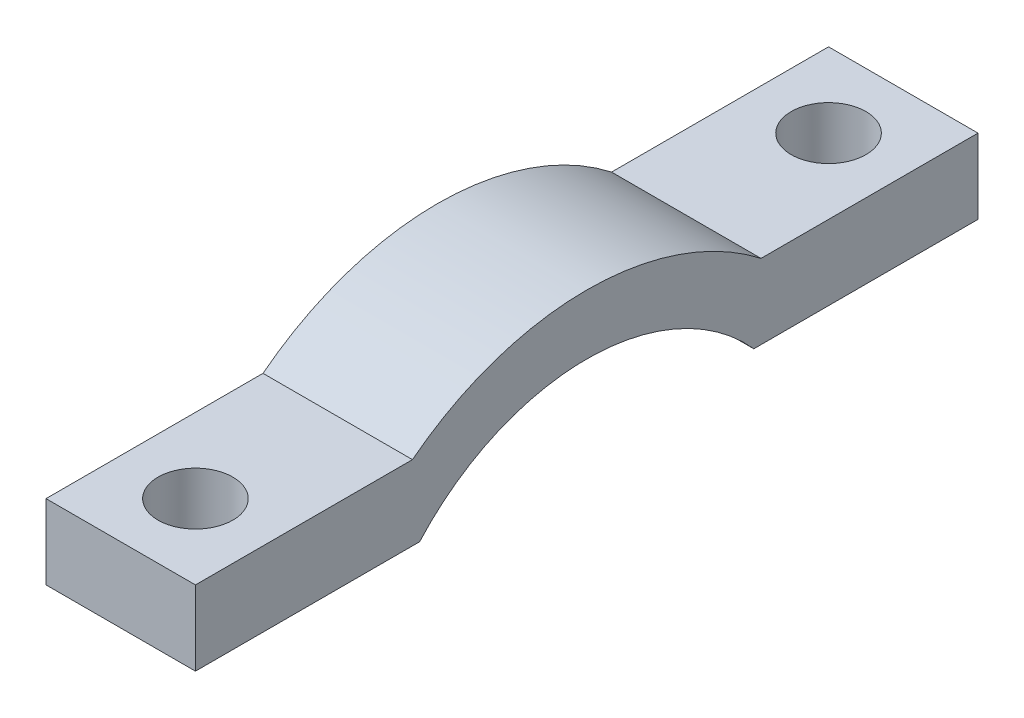
ISO-10303-21;
HEADER;
FILE_DESCRIPTION(('STEP AP214'),'2;1');
FILE_NAME('part.step','',(''),(''),'','','');
FILE_SCHEMA(('AUTOMOTIVE_DESIGN { 1 0 10303 214 1 1 1 1 }'));
ENDSEC;
DATA;
#1=APPLICATION_CONTEXT('core data for automotive mechanical design processes');
#2=APPLICATION_PROTOCOL_DEFINITION('international standard','automotive_design',2000,#1);
#3=PRODUCT_CONTEXT('',#1,'mechanical');
#4=PRODUCT('Part','Part','',(#3));
#5=PRODUCT_RELATED_PRODUCT_CATEGORY('part','',(#4));
#6=PRODUCT_DEFINITION_FORMATION('','',#4);
#7=PRODUCT_DEFINITION_CONTEXT('part definition',#1,'design');
#8=PRODUCT_DEFINITION('design','',#6,#7);
#9=PRODUCT_DEFINITION_SHAPE('','',#8);
#10=(LENGTH_UNIT() NAMED_UNIT(*) SI_UNIT(.MILLI.,.METRE.));
#11=(NAMED_UNIT(*) PLANE_ANGLE_UNIT() SI_UNIT($,.RADIAN.));
#12=(NAMED_UNIT(*) SI_UNIT($,.STERADIAN.) SOLID_ANGLE_UNIT());
#13=UNCERTAINTY_MEASURE_WITH_UNIT(LENGTH_MEASURE(1.E-05),#10,'distance_accuracy_value','');
#14=(GEOMETRIC_REPRESENTATION_CONTEXT(3) GLOBAL_UNCERTAINTY_ASSIGNED_CONTEXT((#13)) GLOBAL_UNIT_ASSIGNED_CONTEXT((#10,
#11,#12)) REPRESENTATION_CONTEXT('',''));
#15=CARTESIAN_POINT('',(0.,0.,0.));
#16=DIRECTION('',(0.,0.,1.));
#17=DIRECTION('',(1.,0.,0.));
#18=AXIS2_PLACEMENT_3D('',#15,#16,#17);
#19=CARTESIAN_POINT('',(10.,15.,0.));
#20=DIRECTION('',(0.,-1.,0.));
#21=DIRECTION('',(0.,0.,-1.));
#22=AXIS2_PLACEMENT_3D('',#19,#20,#21);
#23=PLANE('',#22);
#24=CARTESIAN_POINT('',(5.,15.,-21.180339887499));
#25=DIRECTION('',(0.,-1.,0.));
#26=DIRECTION('',(0.,0.,-1.));
#27=AXIS2_PLACEMENT_3D('',#24,#25,#26);
#28=CIRCLE('',#27,2.5);
#29=CARTESIAN_POINT('',(5.,15.,-23.680339887499));
#30=VERTEX_POINT('',#29);
#31=EDGE_CURVE('E185',#30,#30,#28,.T.);
#32=ORIENTED_EDGE('',*,*,#31,.T.);
#33=EDGE_LOOP('',(#32));
#34=FACE_BOUND('',#33,.T.);
#35=DIRECTION('',(0.,0.,1.));
#36=VECTOR('',#35,1.);
#37=CARTESIAN_POINT('',(0.,15.,0.));
#38=LINE('',#37,#36);
#39=CARTESIAN_POINT('',(0.,15.,-26.1803398874989));
#40=VERTEX_POINT('',#39);
#41=CARTESIAN_POINT('',(0.,15.,-11.6619037896906));
#42=VERTEX_POINT('',#41);
#43=EDGE_CURVE('E133',#40,#42,#38,.T.);
#44=ORIENTED_EDGE('',*,*,#43,.T.);
#45=DIRECTION('',(-1.,0.,0.));
#46=VECTOR('',#45,1.);
#47=CARTESIAN_POINT('',(10.,15.,-11.6619037896906));
#48=LINE('',#47,#46);
#49=CARTESIAN_POINT('',(10.,15.,-11.6619037896906));
#50=VERTEX_POINT('',#49);
#51=EDGE_CURVE('E11',#50,#42,#48,.T.);
#52=ORIENTED_EDGE('',*,*,#51,.F.);
#53=DIRECTION('',(0.,0.,1.));
#54=VECTOR('',#53,1.);
#55=CARTESIAN_POINT('',(10.,15.,0.));
#56=LINE('',#55,#54);
#57=CARTESIAN_POINT('',(10.,15.,-26.1803398874989));
#58=VERTEX_POINT('',#57);
#59=EDGE_CURVE('E154',#58,#50,#56,.T.);
#60=ORIENTED_EDGE('',*,*,#59,.F.);
#61=DIRECTION('',(-1.,0.,0.));
#62=VECTOR('',#61,1.);
#63=CARTESIAN_POINT('',(10.,15.,-26.1803398874989));
#64=LINE('',#63,#62);
#65=EDGE_CURVE('E50',#58,#40,#64,.T.);
#66=ORIENTED_EDGE('',*,*,#65,.T.);
#67=EDGE_LOOP('',(#44,#52,#60,#66));
#68=FACE_BOUND('',#67,.T.);
#69=ADVANCED_FACE('F34',(#34,#68),#23,.F.);
#70=CARTESIAN_POINT('',(10.,0.,0.));
#71=DIRECTION('',(-1.,0.,0.));
#72=DIRECTION('',(0.,0.,1.));
#73=AXIS2_PLACEMENT_3D('',#70,#71,#72);
#74=CYLINDRICAL_SURFACE('',#73,19.);
#75=CARTESIAN_POINT('',(0.,0.,0.));
#76=DIRECTION('',(1.,0.,0.));
#77=DIRECTION('',(0.,0.,-1.));
#78=AXIS2_PLACEMENT_3D('',#75,#76,#77);
#79=CIRCLE('',#78,19.);
#80=CARTESIAN_POINT('',(0.,15.,11.6619037896906));
#81=VERTEX_POINT('',#80);
#82=EDGE_CURVE('E135',#42,#81,#79,.T.);
#83=ORIENTED_EDGE('',*,*,#82,.T.);
#84=DIRECTION('',(-1.,0.,0.));
#85=VECTOR('',#84,1.);
#86=CARTESIAN_POINT('',(10.,15.,11.6619037896906));
#87=LINE('',#86,#85);
#88=CARTESIAN_POINT('',(10.,15.,11.6619037896906));
#89=VERTEX_POINT('',#88);
#90=EDGE_CURVE('E42',#89,#81,#87,.T.);
#91=ORIENTED_EDGE('',*,*,#90,.F.);
#92=CARTESIAN_POINT('',(10.,0.,0.));
#93=DIRECTION('',(1.,0.,0.));
#94=DIRECTION('',(0.,0.,-1.));
#95=AXIS2_PLACEMENT_3D('',#92,#93,#94);
#96=CIRCLE('',#95,19.);
#97=EDGE_CURVE('E89',#50,#89,#96,.T.);
#98=ORIENTED_EDGE('',*,*,#97,.F.);
#99=ORIENTED_EDGE('',*,*,#51,.T.);
#100=EDGE_LOOP('',(#83,#91,#98,#99));
#101=FACE_BOUND('',#100,.T.);
#102=ADVANCED_FACE('F167',(#101),#74,.T.);
#103=CARTESIAN_POINT('',(10.,15.,0.));
#104=DIRECTION('',(0.,1.,0.));
#105=DIRECTION('',(0.,0.,1.));
#106=AXIS2_PLACEMENT_3D('',#103,#104,#105);
#107=PLANE('',#106);
#108=CARTESIAN_POINT('',(5.,15.,21.180339887499));
#109=DIRECTION('',(0.,1.,0.));
#110=DIRECTION('',(0.,0.,1.));
#111=AXIS2_PLACEMENT_3D('',#108,#109,#110);
#112=CIRCLE('',#111,2.5);
#113=CARTESIAN_POINT('',(5.,15.,23.680339887499));
#114=VERTEX_POINT('',#113);
#115=EDGE_CURVE('E136',#114,#114,#112,.T.);
#116=ORIENTED_EDGE('',*,*,#115,.F.);
#117=EDGE_LOOP('',(#116));
#118=FACE_BOUND('',#117,.T.);
#119=DIRECTION('',(0.,0.,-1.));
#120=VECTOR('',#119,1.);
#121=CARTESIAN_POINT('',(0.,15.,0.));
#122=LINE('',#121,#120);
#123=CARTESIAN_POINT('',(0.,15.,26.1803398874989));
#124=VERTEX_POINT('',#123);
#125=EDGE_CURVE('E139',#124,#81,#122,.T.);
#126=ORIENTED_EDGE('',*,*,#125,.F.);
#127=DIRECTION('',(-1.,0.,0.));
#128=VECTOR('',#127,1.);
#129=CARTESIAN_POINT('',(10.,15.,26.1803398874989));
#130=LINE('',#129,#128);
#131=CARTESIAN_POINT('',(10.,15.,26.1803398874989));
#132=VERTEX_POINT('',#131);
#133=EDGE_CURVE('E160',#132,#124,#130,.T.);
#134=ORIENTED_EDGE('',*,*,#133,.F.);
#135=DIRECTION('',(0.,0.,-1.));
#136=VECTOR('',#135,1.);
#137=CARTESIAN_POINT('',(10.,15.,0.));
#138=LINE('',#137,#136);
#139=EDGE_CURVE('E166',#132,#89,#138,.T.);
#140=ORIENTED_EDGE('',*,*,#139,.T.);
#141=ORIENTED_EDGE('',*,*,#90,.T.);
#142=EDGE_LOOP('',(#126,#134,#140,#141));
#143=FACE_BOUND('',#142,.T.);
#144=ADVANCED_FACE('F164',(#118,#143),#107,.T.);
#145=CARTESIAN_POINT('',(10.,0.,26.1803398874989));
#146=DIRECTION('',(0.,0.,1.));
#147=DIRECTION('',(1.,0.,0.));
#148=AXIS2_PLACEMENT_3D('',#145,#146,#147);
#149=PLANE('',#148);
#150=DIRECTION('',(0.,1.,0.));
#151=VECTOR('',#150,1.);
#152=CARTESIAN_POINT('',(0.,0.,26.1803398874989));
#153=LINE('',#152,#151);
#154=CARTESIAN_POINT('',(0.,10.,26.1803398874989));
#155=VERTEX_POINT('',#154);
#156=EDGE_CURVE('E142',#155,#124,#153,.T.);
#157=ORIENTED_EDGE('',*,*,#156,.F.);
#158=DIRECTION('',(-1.,0.,0.));
#159=VECTOR('',#158,1.);
#160=CARTESIAN_POINT('',(10.,10.,26.1803398874989));
#161=LINE('',#160,#159);
#162=CARTESIAN_POINT('',(10.,10.,26.1803398874989));
#163=VERTEX_POINT('',#162);
#164=EDGE_CURVE('E158',#163,#155,#161,.T.);
#165=ORIENTED_EDGE('',*,*,#164,.F.);
#166=DIRECTION('',(0.,1.,0.));
#167=VECTOR('',#166,1.);
#168=CARTESIAN_POINT('',(10.,0.,26.1803398874989));
#169=LINE('',#168,#167);
#170=EDGE_CURVE('E128',#163,#132,#169,.T.);
#171=ORIENTED_EDGE('',*,*,#170,.T.);
#172=ORIENTED_EDGE('',*,*,#133,.T.);
#173=EDGE_LOOP('',(#157,#165,#171,#172));
#174=FACE_BOUND('',#173,.T.);
#175=ADVANCED_FACE('F174',(#174),#149,.T.);
#176=CARTESIAN_POINT('',(10.,10.,0.));
#177=DIRECTION('',(0.,-1.,0.));
#178=DIRECTION('',(0.,0.,-1.));
#179=AXIS2_PLACEMENT_3D('',#176,#177,#178);
#180=PLANE('',#179);
#181=CARTESIAN_POINT('',(5.,10.,21.180339887499));
#182=DIRECTION('',(0.,-1.,0.));
#183=DIRECTION('',(0.,0.,-1.));
#184=AXIS2_PLACEMENT_3D('',#181,#182,#183);
#185=CIRCLE('',#184,2.5);
#186=CARTESIAN_POINT('',(5.,10.,18.680339887499));
#187=VERTEX_POINT('',#186);
#188=EDGE_CURVE('E182',#187,#187,#185,.T.);
#189=ORIENTED_EDGE('',*,*,#188,.F.);
#190=EDGE_LOOP('',(#189));
#191=FACE_BOUND('',#190,.T.);
#192=DIRECTION('',(0.,0.,1.));
#193=VECTOR('',#192,1.);
#194=CARTESIAN_POINT('',(0.,10.,0.));
#195=LINE('',#194,#193);
#196=CARTESIAN_POINT('',(0.,10.,11.1803398874989));
#197=VERTEX_POINT('',#196);
#198=EDGE_CURVE('E145',#197,#155,#195,.T.);
#199=ORIENTED_EDGE('',*,*,#198,.F.);
#200=DIRECTION('',(-1.,0.,0.));
#201=VECTOR('',#200,1.);
#202=CARTESIAN_POINT('',(10.,10.,11.1803398874989));
#203=LINE('',#202,#201);
#204=CARTESIAN_POINT('',(10.,10.,11.1803398874989));
#205=VERTEX_POINT('',#204);
#206=EDGE_CURVE('E114',#205,#197,#203,.T.);
#207=ORIENTED_EDGE('',*,*,#206,.F.);
#208=DIRECTION('',(0.,0.,1.));
#209=VECTOR('',#208,1.);
#210=CARTESIAN_POINT('',(10.,10.,0.));
#211=LINE('',#210,#209);
#212=EDGE_CURVE('E126',#205,#163,#211,.T.);
#213=ORIENTED_EDGE('',*,*,#212,.T.);
#214=ORIENTED_EDGE('',*,*,#164,.T.);
#215=EDGE_LOOP('',(#199,#207,#213,#214));
#216=FACE_BOUND('',#215,.T.);
#217=ADVANCED_FACE('F203',(#191,#216),#180,.T.);
#218=CARTESIAN_POINT('',(10.,0.,0.));
#219=DIRECTION('',(-1.,0.,0.));
#220=DIRECTION('',(0.,0.,1.));
#221=AXIS2_PLACEMENT_3D('',#218,#219,#220);
#222=CYLINDRICAL_SURFACE('',#221,15.);
#223=CARTESIAN_POINT('',(0.,0.,0.));
#224=DIRECTION('',(1.,0.,0.));
#225=DIRECTION('',(0.,0.,-1.));
#226=AXIS2_PLACEMENT_3D('',#223,#224,#225);
#227=CIRCLE('',#226,15.);
#228=CARTESIAN_POINT('',(0.,10.,-11.1803398874989));
#229=VERTEX_POINT('',#228);
#230=EDGE_CURVE('E111',#229,#197,#227,.T.);
#231=ORIENTED_EDGE('',*,*,#230,.F.);
#232=DIRECTION('',(-1.,0.,0.));
#233=VECTOR('',#232,1.);
#234=CARTESIAN_POINT('',(10.,10.,-11.1803398874989));
#235=LINE('',#234,#233);
#236=CARTESIAN_POINT('',(10.,10.,-11.1803398874989));
#237=VERTEX_POINT('',#236);
#238=EDGE_CURVE('E105',#237,#229,#235,.T.);
#239=ORIENTED_EDGE('',*,*,#238,.F.);
#240=CARTESIAN_POINT('',(10.,0.,0.));
#241=DIRECTION('',(1.,0.,0.));
#242=DIRECTION('',(0.,0.,-1.));
#243=AXIS2_PLACEMENT_3D('',#240,#241,#242);
#244=CIRCLE('',#243,15.);
#245=EDGE_CURVE('E109',#237,#205,#244,.T.);
#246=ORIENTED_EDGE('',*,*,#245,.T.);
#247=ORIENTED_EDGE('',*,*,#206,.T.);
#248=EDGE_LOOP('',(#231,#239,#246,#247));
#249=FACE_BOUND('',#248,.T.);
#250=ADVANCED_FACE('F107',(#249),#222,.F.);
#251=CARTESIAN_POINT('',(10.,10.,0.));
#252=DIRECTION('',(0.,1.,0.));
#253=DIRECTION('',(0.,0.,1.));
#254=AXIS2_PLACEMENT_3D('',#251,#252,#253);
#255=PLANE('',#254);
#256=CARTESIAN_POINT('',(5.,10.,-21.180339887499));
#257=DIRECTION('',(0.,-1.,0.));
#258=DIRECTION('',(0.,0.,1.));
#259=AXIS2_PLACEMENT_3D('',#256,#257,#258);
#260=CIRCLE('',#259,2.5);
#261=CARTESIAN_POINT('',(5.,10.,-18.680339887499));
#262=VERTEX_POINT('',#261);
#263=EDGE_CURVE('E188',#262,#262,#260,.T.);
#264=ORIENTED_EDGE('',*,*,#263,.F.);
#265=EDGE_LOOP('',(#264));
#266=FACE_BOUND('',#265,.T.);
#267=DIRECTION('',(0.,0.,-1.));
#268=VECTOR('',#267,1.);
#269=CARTESIAN_POINT('',(0.,10.,0.));
#270=LINE('',#269,#268);
#271=CARTESIAN_POINT('',(0.,10.,-26.1803398874989));
#272=VERTEX_POINT('',#271);
#273=EDGE_CURVE('E149',#229,#272,#270,.T.);
#274=ORIENTED_EDGE('',*,*,#273,.T.);
#275=DIRECTION('',(-1.,0.,0.));
#276=VECTOR('',#275,1.);
#277=CARTESIAN_POINT('',(10.,10.,-26.1803398874989));
#278=LINE('',#277,#276);
#279=CARTESIAN_POINT('',(10.,10.,-26.1803398874989));
#280=VERTEX_POINT('',#279);
#281=EDGE_CURVE('E77',#280,#272,#278,.T.);
#282=ORIENTED_EDGE('',*,*,#281,.F.);
#283=DIRECTION('',(0.,0.,-1.));
#284=VECTOR('',#283,1.);
#285=CARTESIAN_POINT('',(10.,10.,0.));
#286=LINE('',#285,#284);
#287=EDGE_CURVE('E116',#237,#280,#286,.T.);
#288=ORIENTED_EDGE('',*,*,#287,.F.);
#289=ORIENTED_EDGE('',*,*,#238,.T.);
#290=EDGE_LOOP('',(#274,#282,#288,#289));
#291=FACE_BOUND('',#290,.T.);
#292=ADVANCED_FACE('F117',(#266,#291),#255,.F.);
#293=CARTESIAN_POINT('',(10.,0.,-26.180339887499));
#294=DIRECTION('',(0.,0.,-1.));
#295=DIRECTION('',(0.,1.,0.));
#296=AXIS2_PLACEMENT_3D('',#293,#294,#295);
#297=PLANE('',#296);
#298=DIRECTION('',(0.,-1.,0.));
#299=VECTOR('',#298,1.);
#300=CARTESIAN_POINT('',(0.,0.,-26.180339887499));
#301=LINE('',#300,#299);
#302=EDGE_CURVE('E151',#40,#272,#301,.T.);
#303=ORIENTED_EDGE('',*,*,#302,.F.);
#304=ORIENTED_EDGE('',*,*,#65,.F.);
#305=DIRECTION('',(0.,-1.,0.));
#306=VECTOR('',#305,1.);
#307=CARTESIAN_POINT('',(10.,0.,-26.180339887499));
#308=LINE('',#307,#306);
#309=EDGE_CURVE('E120',#58,#280,#308,.T.);
#310=ORIENTED_EDGE('',*,*,#309,.T.);
#311=ORIENTED_EDGE('',*,*,#281,.T.);
#312=EDGE_LOOP('',(#303,#304,#310,#311));
#313=FACE_BOUND('',#312,.T.);
#314=ADVANCED_FACE('F196',(#313),#297,.T.);
#315=CARTESIAN_POINT('',(10.,0.,0.));
#316=DIRECTION('',(1.,0.,0.));
#317=DIRECTION('',(0.,0.,-1.));
#318=AXIS2_PLACEMENT_3D('',#315,#316,#317);
#319=PLANE('',#318);
#320=ORIENTED_EDGE('',*,*,#59,.T.);
#321=ORIENTED_EDGE('',*,*,#97,.T.);
#322=ORIENTED_EDGE('',*,*,#139,.F.);
#323=ORIENTED_EDGE('',*,*,#170,.F.);
#324=ORIENTED_EDGE('',*,*,#212,.F.);
#325=ORIENTED_EDGE('',*,*,#245,.F.);
#326=ORIENTED_EDGE('',*,*,#287,.T.);
#327=ORIENTED_EDGE('',*,*,#309,.F.);
#328=EDGE_LOOP('',(#320,#321,#322,#323,#324,#325,#326,#327));
#329=FACE_BOUND('',#328,.T.);
#330=ADVANCED_FACE('F123',(#329),#319,.T.);
#331=CARTESIAN_POINT('',(0.,0.,0.));
#332=DIRECTION('',(1.,0.,0.));
#333=DIRECTION('',(0.,0.,-1.));
#334=AXIS2_PLACEMENT_3D('',#331,#332,#333);
#335=PLANE('',#334);
#336=ORIENTED_EDGE('',*,*,#43,.F.);
#337=ORIENTED_EDGE('',*,*,#302,.T.);
#338=ORIENTED_EDGE('',*,*,#273,.F.);
#339=ORIENTED_EDGE('',*,*,#230,.T.);
#340=ORIENTED_EDGE('',*,*,#198,.T.);
#341=ORIENTED_EDGE('',*,*,#156,.T.);
#342=ORIENTED_EDGE('',*,*,#125,.T.);
#343=ORIENTED_EDGE('',*,*,#82,.F.);
#344=EDGE_LOOP('',(#336,#337,#338,#339,#340,#341,#342,#343));
#345=FACE_BOUND('',#344,.T.);
#346=ADVANCED_FACE('F170',(#345),#335,.F.);
#347=CARTESIAN_POINT('',(5.,19.,21.180339887499));
#348=DIRECTION('',(0.,-1.,0.));
#349=DIRECTION('',(0.,0.,-1.));
#350=AXIS2_PLACEMENT_3D('',#347,#348,#349);
#351=CYLINDRICAL_SURFACE('',#350,2.5);
#352=ORIENTED_EDGE('',*,*,#115,.T.);
#353=EDGE_LOOP('',(#352));
#354=FACE_BOUND('',#353,.T.);
#355=ORIENTED_EDGE('',*,*,#188,.T.);
#356=EDGE_LOOP('',(#355));
#357=FACE_BOUND('',#356,.T.);
#358=ADVANCED_FACE('F212',(#354,#357),#351,.F.);
#359=CARTESIAN_POINT('',(5.,19.,-21.180339887499));
#360=DIRECTION('',(0.,-1.,0.));
#361=DIRECTION('',(0.,0.,-1.));
#362=AXIS2_PLACEMENT_3D('',#359,#360,#361);
#363=CYLINDRICAL_SURFACE('',#362,2.5);
#364=ORIENTED_EDGE('',*,*,#263,.T.);
#365=EDGE_LOOP('',(#364));
#366=FACE_BOUND('',#365,.T.);
#367=ORIENTED_EDGE('',*,*,#31,.F.);
#368=EDGE_LOOP('',(#367));
#369=FACE_BOUND('',#368,.T.);
#370=ADVANCED_FACE('F192',(#366,#369),#363,.F.);
#371=CLOSED_SHELL('',(#69,#102,#144,#175,#217,#250,#292,#314,#330,#346,#358,#370));
#372=MANIFOLD_SOLID_BREP('B2',#371);
#373=ADVANCED_BREP_SHAPE_REPRESENTATION('',(#18,#372),#14);
#374=SHAPE_DEFINITION_REPRESENTATION(#9,#373);
ENDSEC;
END-ISO-10303-21;
